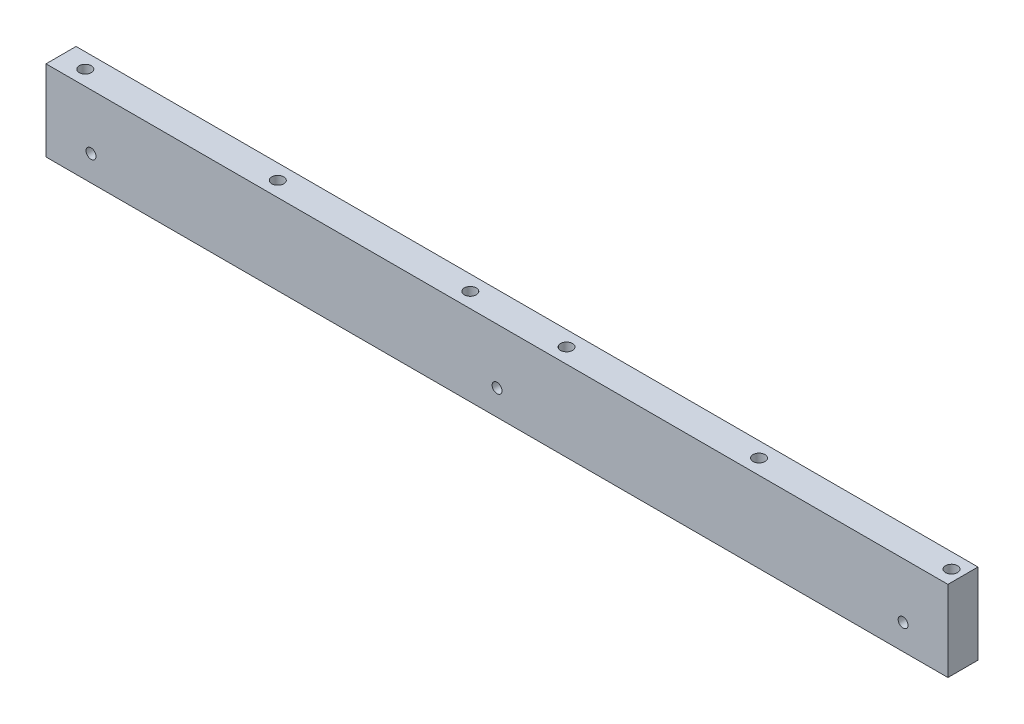
ISO-10303-21;
HEADER;
FILE_DESCRIPTION(('STEP AP214'),'2;1');
FILE_NAME('part.step','',(''),(''),'','','');
FILE_SCHEMA(('AUTOMOTIVE_DESIGN { 1 0 10303 214 1 1 1 1 }'));
ENDSEC;
DATA;
#1=APPLICATION_CONTEXT('core data for automotive mechanical design processes');
#2=APPLICATION_PROTOCOL_DEFINITION('international standard','automotive_design',2000,#1);
#3=PRODUCT_CONTEXT('',#1,'mechanical');
#4=PRODUCT('Part','Part','',(#3));
#5=PRODUCT_RELATED_PRODUCT_CATEGORY('part','',(#4));
#6=PRODUCT_DEFINITION_FORMATION('','',#4);
#7=PRODUCT_DEFINITION_CONTEXT('part definition',#1,'design');
#8=PRODUCT_DEFINITION('design','',#6,#7);
#9=PRODUCT_DEFINITION_SHAPE('','',#8);
#10=(LENGTH_UNIT() NAMED_UNIT(*) SI_UNIT(.MILLI.,.METRE.));
#11=(NAMED_UNIT(*) PLANE_ANGLE_UNIT() SI_UNIT($,.RADIAN.));
#12=(NAMED_UNIT(*) SI_UNIT($,.STERADIAN.) SOLID_ANGLE_UNIT());
#13=UNCERTAINTY_MEASURE_WITH_UNIT(LENGTH_MEASURE(1.E-05),#10,'distance_accuracy_value','');
#14=(GEOMETRIC_REPRESENTATION_CONTEXT(3) GLOBAL_UNCERTAINTY_ASSIGNED_CONTEXT((#13)) GLOBAL_UNIT_ASSIGNED_CONTEXT((#10,
#11,#12)) REPRESENTATION_CONTEXT('',''));
#15=CARTESIAN_POINT('',(0.,0.,0.));
#16=DIRECTION('',(0.,0.,1.));
#17=DIRECTION('',(1.,0.,0.));
#18=AXIS2_PLACEMENT_3D('',#15,#16,#17);
#19=CARTESIAN_POINT('',(-14.9575342492625,-8.48784027490979,26.));
#20=DIRECTION('',(-0.000163272586842843,0.999999986671031,0.));
#21=DIRECTION('',(-0.999999986671031,-0.000163272586842843,0.));
#22=AXIS2_PLACEMENT_3D('',#19,#20,#21);
#23=PLANE('',#22);
#24=CARTESIAN_POINT('',(-6.87153128233984,-8.48652005227056,21.0249021594212));
#25=DIRECTION('',(-0.000163272586842843,0.999999986671031,0.));
#26=DIRECTION('',(-0.999999986671031,-0.000163272586842843,0.));
#27=AXIS2_PLACEMENT_3D('',#24,#25,#26);
#28=CIRCLE('',#27,2.00326040741542);
#29=CARTESIAN_POINT('',(-8.87479166305386,-8.4868471297794,21.0249021594212));
#30=VERTEX_POINT('',#29);
#31=EDGE_CURVE('E136',#30,#30,#28,.T.);
#32=ORIENTED_EDGE('',*,*,#31,.T.);
#33=EDGE_LOOP('',(#32));
#34=FACE_BOUND('',#33,.T.);
#35=CARTESIAN_POINT('',(57.1284678646062,-8.47607060671262,21.0249021594212));
#36=DIRECTION('',(-0.000163272586842843,0.999999986671031,0.));
#37=DIRECTION('',(-0.999999986671031,-0.000163272586842843,0.));
#38=AXIS2_PLACEMENT_3D('',#35,#36,#37);
#39=CIRCLE('',#38,2.00326040741543);
#40=CARTESIAN_POINT('',(55.1252074838921,-8.47639768422146,21.0249021594212));
#41=VERTEX_POINT('',#40);
#42=EDGE_CURVE('E140',#41,#41,#39,.T.);
#43=ORIENTED_EDGE('',*,*,#42,.T.);
#44=EDGE_LOOP('',(#43));
#45=FACE_BOUND('',#44,.T.);
#46=CARTESIAN_POINT('',(121.128467011552,-8.46562116115468,21.0249021594212));
#47=DIRECTION('',(-0.000163272586842843,0.999999986671031,0.));
#48=DIRECTION('',(-0.999999986671031,-0.000163272586842843,0.));
#49=AXIS2_PLACEMENT_3D('',#46,#47,#48);
#50=CIRCLE('',#49,2.00326040741542);
#51=CARTESIAN_POINT('',(119.125206630838,-8.46594823866351,21.0249021594212));
#52=VERTEX_POINT('',#51);
#53=EDGE_CURVE('E144',#52,#52,#50,.T.);
#54=ORIENTED_EDGE('',*,*,#53,.T.);
#55=EDGE_LOOP('',(#54));
#56=FACE_BOUND('',#55,.T.);
#57=CARTESIAN_POINT('',(153.128466585025,-8.46039643837571,21.0249021594212));
#58=DIRECTION('',(-0.000163272586842843,0.999999986671031,0.));
#59=DIRECTION('',(-0.999999986671031,-0.000163272586842843,0.));
#60=AXIS2_PLACEMENT_3D('',#57,#58,#59);
#61=CIRCLE('',#60,2.00326040741541);
#62=CARTESIAN_POINT('',(151.125206204311,-8.46072351588455,21.0249021594212));
#63=VERTEX_POINT('',#62);
#64=EDGE_CURVE('E148',#63,#63,#61,.T.);
#65=ORIENTED_EDGE('',*,*,#64,.T.);
#66=EDGE_LOOP('',(#65));
#67=FACE_BOUND('',#66,.T.);
#68=CARTESIAN_POINT('',(217.128465731971,-8.44994699281776,21.0249021594212));
#69=DIRECTION('',(-0.000163272586842843,0.999999986671031,0.));
#70=DIRECTION('',(-0.999999986671031,-0.000163272586842843,0.));
#71=AXIS2_PLACEMENT_3D('',#68,#69,#70);
#72=CIRCLE('',#71,2.00326040741541);
#73=CARTESIAN_POINT('',(215.125205351257,-8.4502740703266,21.0249021594212));
#74=VERTEX_POINT('',#73);
#75=EDGE_CURVE('E152',#74,#74,#72,.T.);
#76=ORIENTED_EDGE('',*,*,#75,.T.);
#77=EDGE_LOOP('',(#76));
#78=FACE_BOUND('',#77,.T.);
#79=CARTESIAN_POINT('',(281.128464878917,-8.43949754725982,21.0249021594212));
#80=DIRECTION('',(-0.000163272586842843,0.999999986671031,0.));
#81=DIRECTION('',(-0.999999986671031,-0.000163272586842843,0.));
#82=AXIS2_PLACEMENT_3D('',#79,#80,#81);
#83=CIRCLE('',#82,2.00326040741546);
#84=CARTESIAN_POINT('',(279.125204498203,-8.43982462476866,21.0249021594212));
#85=VERTEX_POINT('',#84);
#86=EDGE_CURVE('E155',#85,#85,#83,.T.);
#87=ORIENTED_EDGE('',*,*,#86,.T.);
#88=EDGE_LOOP('',(#87));
#89=FACE_BOUND('',#88,.T.);
#90=DIRECTION('',(0.999999986671031,0.000163272586842843,0.));
#91=VECTOR('',#90,1.);
#92=CARTESIAN_POINT('',(-14.9575342492625,-8.48784027490979,16.));
#93=LINE('',#92,#91);
#94=CARTESIAN_POINT('',(-14.9575342492625,-8.48784027490979,16.));
#95=VERTEX_POINT('',#94);
#96=CARTESIAN_POINT('',(284.912453052527,-8.4388797257139,16.));
#97=VERTEX_POINT('',#96);
#98=EDGE_CURVE('E98',#95,#97,#93,.T.);
#99=ORIENTED_EDGE('',*,*,#98,.T.);
#100=DIRECTION('',(0.,0.,-1.));
#101=VECTOR('',#100,1.);
#102=CARTESIAN_POINT('',(284.912453052527,-8.4388797257139,26.));
#103=LINE('',#102,#101);
#104=CARTESIAN_POINT('',(284.912453052527,-8.4388797257139,26.));
#105=VERTEX_POINT('',#104);
#106=EDGE_CURVE('E11',#105,#97,#103,.T.);
#107=ORIENTED_EDGE('',*,*,#106,.F.);
#108=DIRECTION('',(0.999999986671031,0.000163272586842843,0.));
#109=VECTOR('',#108,1.);
#110=CARTESIAN_POINT('',(-14.9575342492625,-8.48784027490979,26.));
#111=LINE('',#110,#109);
#112=CARTESIAN_POINT('',(-14.9575342492625,-8.48784027490979,26.));
#113=VERTEX_POINT('',#112);
#114=EDGE_CURVE('E75',#113,#105,#111,.T.);
#115=ORIENTED_EDGE('',*,*,#114,.F.);
#116=DIRECTION('',(0.,0.,-1.));
#117=VECTOR('',#116,1.);
#118=CARTESIAN_POINT('',(-14.9575342492625,-8.48784027490979,26.));
#119=LINE('',#118,#117);
#120=EDGE_CURVE('E94',#113,#95,#119,.T.);
#121=ORIENTED_EDGE('',*,*,#120,.T.);
#122=EDGE_LOOP('',(#99,#107,#115,#121));
#123=FACE_BOUND('',#122,.T.);
#124=ADVANCED_FACE('F36',(#34,#45,#56,#67,#78,#89,#123),#23,.F.);
#125=CARTESIAN_POINT('',(284.908071309528,18.3980990053308,26.));
#126=DIRECTION('',(0.999999986671031,0.000163272586843374,0.));
#127=DIRECTION('',(-0.000163272586843374,0.999999986671031,0.));
#128=AXIS2_PLACEMENT_3D('',#125,#126,#127);
#129=PLANE('',#128);
#130=DIRECTION('',(0.000163272586843374,-0.999999986671031,0.));
#131=VECTOR('',#130,1.);
#132=CARTESIAN_POINT('',(284.908071309528,18.3980990053308,16.));
#133=LINE('',#132,#131);
#134=CARTESIAN_POINT('',(284.908071309528,18.3980990053308,16.));
#135=VERTEX_POINT('',#134);
#136=EDGE_CURVE('E84',#135,#97,#133,.T.);
#137=ORIENTED_EDGE('',*,*,#136,.F.);
#138=DIRECTION('',(0.,0.,-1.));
#139=VECTOR('',#138,1.);
#140=CARTESIAN_POINT('',(284.908071309528,18.3980990053308,26.));
#141=LINE('',#140,#139);
#142=CARTESIAN_POINT('',(284.908071309528,18.3980990053308,26.));
#143=VERTEX_POINT('',#142);
#144=EDGE_CURVE('E44',#143,#135,#141,.T.);
#145=ORIENTED_EDGE('',*,*,#144,.F.);
#146=DIRECTION('',(0.000163272586843374,-0.999999986671031,0.));
#147=VECTOR('',#146,1.);
#148=CARTESIAN_POINT('',(284.908071309528,18.3980990053308,26.));
#149=LINE('',#148,#147);
#150=EDGE_CURVE('E82',#143,#105,#149,.T.);
#151=ORIENTED_EDGE('',*,*,#150,.T.);
#152=ORIENTED_EDGE('',*,*,#106,.T.);
#153=EDGE_LOOP('',(#137,#145,#151,#152));
#154=FACE_BOUND('',#153,.T.);
#155=ADVANCED_FACE('F81',(#154),#129,.T.);
#156=CARTESIAN_POINT('',(-14.9619159922614,18.3491384561349,26.));
#157=DIRECTION('',(-0.000163272586842843,0.999999986671031,0.));
#158=DIRECTION('',(-0.999999986671031,-0.000163272586842843,0.));
#159=AXIS2_PLACEMENT_3D('',#156,#157,#158);
#160=PLANE('',#159);
#161=CARTESIAN_POINT('',(-6.8759130253387,18.3504586787741,21.0249021594212));
#162=DIRECTION('',(-0.000163272586842843,0.999999986671031,0.));
#163=DIRECTION('',(-0.999999986671031,-0.000163272586842843,0.));
#164=AXIS2_PLACEMENT_3D('',#161,#162,#163);
#165=CIRCLE('',#164,2.00326040741542);
#166=CARTESIAN_POINT('',(-8.87917340605273,18.3501316012653,21.0249021594212));
#167=VERTEX_POINT('',#166);
#168=EDGE_CURVE('E157',#167,#167,#165,.T.);
#169=ORIENTED_EDGE('',*,*,#168,.F.);
#170=EDGE_LOOP('',(#169));
#171=FACE_BOUND('',#170,.T.);
#172=CARTESIAN_POINT('',(57.1240861216073,18.3609081243321,21.0249021594212));
#173=DIRECTION('',(-0.000163272586842843,0.999999986671031,0.));
#174=DIRECTION('',(-0.999999986671031,-0.000163272586842843,0.));
#175=AXIS2_PLACEMENT_3D('',#172,#173,#174);
#176=CIRCLE('',#175,2.00326040741543);
#177=CARTESIAN_POINT('',(55.1208257408933,18.3605810468232,21.0249021594212));
#178=VERTEX_POINT('',#177);
#179=EDGE_CURVE('E161',#178,#178,#176,.T.);
#180=ORIENTED_EDGE('',*,*,#179,.F.);
#181=EDGE_LOOP('',(#180));
#182=FACE_BOUND('',#181,.T.);
#183=CARTESIAN_POINT('',(121.124085268553,18.37135756989,21.0249021594212));
#184=DIRECTION('',(-0.000163272586842843,0.999999986671031,0.));
#185=DIRECTION('',(-0.999999986671031,-0.000163272586842843,0.));
#186=AXIS2_PLACEMENT_3D('',#183,#184,#185);
#187=CIRCLE('',#186,2.00326040741542);
#188=CARTESIAN_POINT('',(119.120824887839,18.3710304923812,21.0249021594212));
#189=VERTEX_POINT('',#188);
#190=EDGE_CURVE('E242',#189,#189,#187,.T.);
#191=ORIENTED_EDGE('',*,*,#190,.F.);
#192=EDGE_LOOP('',(#191));
#193=FACE_BOUND('',#192,.T.);
#194=CARTESIAN_POINT('',(153.124084842026,18.376582292669,21.0249021594212));
#195=DIRECTION('',(-0.000163272586842843,0.999999986671031,0.));
#196=DIRECTION('',(-0.999999986671031,-0.000163272586842843,0.));
#197=AXIS2_PLACEMENT_3D('',#194,#195,#196);
#198=CIRCLE('',#197,2.00326040741541);
#199=CARTESIAN_POINT('',(151.120824461312,18.3762552151601,21.0249021594212));
#200=VERTEX_POINT('',#199);
#201=EDGE_CURVE('E246',#200,#200,#198,.T.);
#202=ORIENTED_EDGE('',*,*,#201,.F.);
#203=EDGE_LOOP('',(#202));
#204=FACE_BOUND('',#203,.T.);
#205=CARTESIAN_POINT('',(217.124083988972,18.3870317382269,21.0249021594212));
#206=DIRECTION('',(-0.000163272586842843,0.999999986671031,0.));
#207=DIRECTION('',(-0.999999986671031,-0.000163272586842843,0.));
#208=AXIS2_PLACEMENT_3D('',#205,#206,#207);
#209=CIRCLE('',#208,2.00326040741541);
#210=CARTESIAN_POINT('',(215.120823608258,18.3867046607181,21.0249021594212));
#211=VERTEX_POINT('',#210);
#212=EDGE_CURVE('E250',#211,#211,#209,.T.);
#213=ORIENTED_EDGE('',*,*,#212,.F.);
#214=EDGE_LOOP('',(#213));
#215=FACE_BOUND('',#214,.T.);
#216=CARTESIAN_POINT('',(281.124083135918,18.3974811837849,21.0249021594212));
#217=DIRECTION('',(-0.000163272586842843,0.999999986671031,0.));
#218=DIRECTION('',(-0.999999986671031,-0.000163272586842843,0.));
#219=AXIS2_PLACEMENT_3D('',#216,#217,#218);
#220=CIRCLE('',#219,2.00326040741546);
#221=CARTESIAN_POINT('',(279.120822755204,18.397154106276,21.0249021594212));
#222=VERTEX_POINT('',#221);
#223=EDGE_CURVE('E164',#222,#222,#220,.T.);
#224=ORIENTED_EDGE('',*,*,#223,.F.);
#225=EDGE_LOOP('',(#224));
#226=FACE_BOUND('',#225,.T.);
#227=DIRECTION('',(0.999999986671031,0.000163272586842843,0.));
#228=VECTOR('',#227,1.);
#229=CARTESIAN_POINT('',(-14.9619159922614,18.3491384561349,16.));
#230=LINE('',#229,#228);
#231=CARTESIAN_POINT('',(-14.9619159922614,18.3491384561349,16.));
#232=VERTEX_POINT('',#231);
#233=EDGE_CURVE('E103',#232,#135,#230,.T.);
#234=ORIENTED_EDGE('',*,*,#233,.F.);
#235=DIRECTION('',(0.,0.,-1.));
#236=VECTOR('',#235,1.);
#237=CARTESIAN_POINT('',(-14.9619159922614,18.3491384561349,26.));
#238=LINE('',#237,#236);
#239=CARTESIAN_POINT('',(-14.9619159922614,18.3491384561349,26.));
#240=VERTEX_POINT('',#239);
#241=EDGE_CURVE('E67',#240,#232,#238,.T.);
#242=ORIENTED_EDGE('',*,*,#241,.F.);
#243=DIRECTION('',(0.999999986671031,0.000163272586842843,0.));
#244=VECTOR('',#243,1.);
#245=CARTESIAN_POINT('',(-14.9619159922614,18.3491384561349,26.));
#246=LINE('',#245,#244);
#247=EDGE_CURVE('E90',#240,#143,#246,.T.);
#248=ORIENTED_EDGE('',*,*,#247,.T.);
#249=ORIENTED_EDGE('',*,*,#144,.T.);
#250=EDGE_LOOP('',(#234,#242,#248,#249));
#251=FACE_BOUND('',#250,.T.);
#252=ADVANCED_FACE('F92',(#171,#182,#193,#204,#215,#226,#251),#160,.T.);
#253=CARTESIAN_POINT('',(-14.9619159922614,18.3491384561349,26.));
#254=DIRECTION('',(0.999999986671031,0.000163272586842857,0.));
#255=DIRECTION('',(-0.000163272586842857,0.999999986671031,0.));
#256=AXIS2_PLACEMENT_3D('',#253,#254,#255);
#257=PLANE('',#256);
#258=DIRECTION('',(0.000163272586842857,-0.999999986671031,0.));
#259=VECTOR('',#258,1.);
#260=CARTESIAN_POINT('',(-14.9619159922614,18.3491384561349,16.));
#261=LINE('',#260,#259);
#262=EDGE_CURVE('E70',#232,#95,#261,.T.);
#263=ORIENTED_EDGE('',*,*,#262,.T.);
#264=ORIENTED_EDGE('',*,*,#120,.F.);
#265=DIRECTION('',(0.000163272586842857,-0.999999986671031,0.));
#266=VECTOR('',#265,1.);
#267=CARTESIAN_POINT('',(-14.9619159922614,18.3491384561349,26.));
#268=LINE('',#267,#266);
#269=EDGE_CURVE('E52',#240,#113,#268,.T.);
#270=ORIENTED_EDGE('',*,*,#269,.F.);
#271=ORIENTED_EDGE('',*,*,#241,.T.);
#272=EDGE_LOOP('',(#263,#264,#270,#271));
#273=FACE_BOUND('',#272,.T.);
#274=ADVANCED_FACE('F122',(#273),#257,.F.);
#275=CARTESIAN_POINT('',(0.,0.,26.));
#276=DIRECTION('',(0.,0.,-1.));
#277=DIRECTION('',(-1.,0.,0.));
#278=AXIS2_PLACEMENT_3D('',#275,#276,#277);
#279=PLANE('',#278);
#280=CARTESIAN_POINT('',(0.00514657222243988,-0.0110711279105043,26.));
#281=DIRECTION('',(0.,0.,-1.));
#282=DIRECTION('',(-1.,0.,0.));
#283=AXIS2_PLACEMENT_3D('',#280,#281,#282);
#284=CIRCLE('',#283,1.65073701686937);
#285=CARTESIAN_POINT('',(-1.64559044464693,-0.0110711279105043,26.));
#286=VERTEX_POINT('',#285);
#287=EDGE_CURVE('E174',#286,#286,#284,.T.);
#288=ORIENTED_EDGE('',*,*,#287,.T.);
#289=EDGE_LOOP('',(#288));
#290=FACE_BOUND('',#289,.T.);
#291=CARTESIAN_POINT('',(269.998815675551,-0.00740826404222681,26.));
#292=DIRECTION('',(0.,0.,-1.));
#293=DIRECTION('',(-1.,0.,0.));
#294=AXIS2_PLACEMENT_3D('',#291,#292,#293);
#295=CIRCLE('',#294,1.63801674296482);
#296=CARTESIAN_POINT('',(268.360798932586,-0.00740826404222681,26.));
#297=VERTEX_POINT('',#296);
#298=EDGE_CURVE('E180',#297,#297,#295,.T.);
#299=ORIENTED_EDGE('',*,*,#298,.T.);
#300=EDGE_LOOP('',(#299));
#301=FACE_BOUND('',#300,.T.);
#302=CARTESIAN_POINT('',(135.002587550413,-0.00593877986236514,26.));
#303=DIRECTION('',(0.,0.,-1.));
#304=DIRECTION('',(-1.,0.,0.));
#305=AXIS2_PLACEMENT_3D('',#302,#303,#304);
#306=CIRCLE('',#305,1.63676002784659);
#307=CARTESIAN_POINT('',(133.365827522567,-0.00593877986236514,26.));
#308=VERTEX_POINT('',#307);
#309=EDGE_CURVE('E101',#308,#308,#306,.T.);
#310=ORIENTED_EDGE('',*,*,#309,.T.);
#311=EDGE_LOOP('',(#310));
#312=FACE_BOUND('',#311,.T.);
#313=ORIENTED_EDGE('',*,*,#114,.T.);
#314=ORIENTED_EDGE('',*,*,#150,.F.);
#315=ORIENTED_EDGE('',*,*,#247,.F.);
#316=ORIENTED_EDGE('',*,*,#269,.T.);
#317=EDGE_LOOP('',(#313,#314,#315,#316));
#318=FACE_BOUND('',#317,.T.);
#319=ADVANCED_FACE('F89',(#290,#301,#312,#318),#279,.F.);
#320=CARTESIAN_POINT('',(0.,0.,16.));
#321=DIRECTION('',(0.,0.,-1.));
#322=DIRECTION('',(-1.,0.,0.));
#323=AXIS2_PLACEMENT_3D('',#320,#321,#322);
#324=PLANE('',#323);
#325=CARTESIAN_POINT('',(0.00514657222243988,-0.0110711279105043,16.));
#326=DIRECTION('',(0.,0.,-1.));
#327=DIRECTION('',(-1.,0.,0.));
#328=AXIS2_PLACEMENT_3D('',#325,#326,#327);
#329=CIRCLE('',#328,1.65073701686937);
#330=CARTESIAN_POINT('',(-1.64559044464693,-0.0110711279105043,16.));
#331=VERTEX_POINT('',#330);
#332=EDGE_CURVE('E171',#331,#331,#329,.T.);
#333=ORIENTED_EDGE('',*,*,#332,.F.);
#334=EDGE_LOOP('',(#333));
#335=FACE_BOUND('',#334,.T.);
#336=CARTESIAN_POINT('',(269.998815675551,-0.00740826404222681,16.));
#337=DIRECTION('',(0.,0.,-1.));
#338=DIRECTION('',(-1.,0.,0.));
#339=AXIS2_PLACEMENT_3D('',#336,#337,#338);
#340=CIRCLE('',#339,1.63801674296482);
#341=CARTESIAN_POINT('',(268.360798932586,-0.00740826404222681,16.));
#342=VERTEX_POINT('',#341);
#343=EDGE_CURVE('E177',#342,#342,#340,.T.);
#344=ORIENTED_EDGE('',*,*,#343,.F.);
#345=EDGE_LOOP('',(#344));
#346=FACE_BOUND('',#345,.T.);
#347=CARTESIAN_POINT('',(135.002587550413,-0.00593877986236514,16.));
#348=DIRECTION('',(0.,0.,-1.));
#349=DIRECTION('',(-1.,0.,0.));
#350=AXIS2_PLACEMENT_3D('',#347,#348,#349);
#351=CIRCLE('',#350,1.63676002784659);
#352=CARTESIAN_POINT('',(133.365827522567,-0.00593877986236514,16.));
#353=VERTEX_POINT('',#352);
#354=EDGE_CURVE('E183',#353,#353,#351,.T.);
#355=ORIENTED_EDGE('',*,*,#354,.F.);
#356=EDGE_LOOP('',(#355));
#357=FACE_BOUND('',#356,.T.);
#358=ORIENTED_EDGE('',*,*,#98,.F.);
#359=ORIENTED_EDGE('',*,*,#262,.F.);
#360=ORIENTED_EDGE('',*,*,#233,.T.);
#361=ORIENTED_EDGE('',*,*,#136,.T.);
#362=EDGE_LOOP('',(#358,#359,#360,#361));
#363=FACE_BOUND('',#362,.T.);
#364=ADVANCED_FACE('F110',(#335,#346,#357,#363),#324,.T.);
#365=CARTESIAN_POINT('',(135.002587550413,-0.00593877986236514,43.));
#366=DIRECTION('',(0.,0.,-1.));
#367=DIRECTION('',(-1.,0.,0.));
#368=AXIS2_PLACEMENT_3D('',#365,#366,#367);
#369=CYLINDRICAL_SURFACE('',#368,1.63676002784659);
#370=ORIENTED_EDGE('',*,*,#354,.T.);
#371=EDGE_LOOP('',(#370));
#372=FACE_BOUND('',#371,.T.);
#373=ORIENTED_EDGE('',*,*,#309,.F.);
#374=EDGE_LOOP('',(#373));
#375=FACE_BOUND('',#374,.T.);
#376=ADVANCED_FACE('F112',(#372,#375),#369,.F.);
#377=CARTESIAN_POINT('',(269.998815675551,-0.00740826404222681,43.));
#378=DIRECTION('',(0.,0.,-1.));
#379=DIRECTION('',(-1.,0.,0.));
#380=AXIS2_PLACEMENT_3D('',#377,#378,#379);
#381=CYLINDRICAL_SURFACE('',#380,1.63801674296482);
#382=ORIENTED_EDGE('',*,*,#343,.T.);
#383=EDGE_LOOP('',(#382));
#384=FACE_BOUND('',#383,.T.);
#385=ORIENTED_EDGE('',*,*,#298,.F.);
#386=EDGE_LOOP('',(#385));
#387=FACE_BOUND('',#386,.T.);
#388=ADVANCED_FACE('F119',(#384,#387),#381,.F.);
#389=CARTESIAN_POINT('',(0.00514657222243988,-0.0110711279105043,43.));
#390=DIRECTION('',(0.,0.,-1.));
#391=DIRECTION('',(-1.,0.,0.));
#392=AXIS2_PLACEMENT_3D('',#389,#390,#391);
#393=CYLINDRICAL_SURFACE('',#392,1.65073701686937);
#394=ORIENTED_EDGE('',*,*,#332,.T.);
#395=EDGE_LOOP('',(#394));
#396=FACE_BOUND('',#395,.T.);
#397=ORIENTED_EDGE('',*,*,#287,.F.);
#398=EDGE_LOOP('',(#397));
#399=FACE_BOUND('',#398,.T.);
#400=ADVANCED_FACE('F196',(#396,#399),#393,.F.);
#401=CARTESIAN_POINT('',(281.128491495763,-8.60251845633297,21.0249021594212));
#402=DIRECTION('',(-0.000163272586842843,0.999999986671031,0.));
#403=DIRECTION('',(-0.999999986671031,-0.000163272586842843,0.));
#404=AXIS2_PLACEMENT_3D('',#401,#402,#403);
#405=CYLINDRICAL_SURFACE('',#404,2.00326040741546);
#406=ORIENTED_EDGE('',*,*,#223,.T.);
#407=EDGE_LOOP('',(#406));
#408=FACE_BOUND('',#407,.T.);
#409=ORIENTED_EDGE('',*,*,#86,.F.);
#410=EDGE_LOOP('',(#409));
#411=FACE_BOUND('',#410,.T.);
#412=ADVANCED_FACE('F202',(#408,#411),#405,.F.);
#413=CARTESIAN_POINT('',(217.128492348817,-8.61296790189091,21.0249021594212));
#414=DIRECTION('',(-0.000163272586842843,0.999999986671031,0.));
#415=DIRECTION('',(-0.999999986671031,-0.000163272586842843,0.));
#416=AXIS2_PLACEMENT_3D('',#413,#414,#415);
#417=CYLINDRICAL_SURFACE('',#416,2.00326040741541);
#418=ORIENTED_EDGE('',*,*,#212,.T.);
#419=EDGE_LOOP('',(#418));
#420=FACE_BOUND('',#419,.T.);
#421=ORIENTED_EDGE('',*,*,#75,.F.);
#422=EDGE_LOOP('',(#421));
#423=FACE_BOUND('',#422,.T.);
#424=ADVANCED_FACE('F208',(#420,#423),#417,.F.);
#425=CARTESIAN_POINT('',(153.128493201871,-8.62341734744886,21.0249021594212));
#426=DIRECTION('',(-0.000163272586842843,0.999999986671031,0.));
#427=DIRECTION('',(-0.999999986671031,-0.000163272586842843,0.));
#428=AXIS2_PLACEMENT_3D('',#425,#426,#427);
#429=CYLINDRICAL_SURFACE('',#428,2.00326040741541);
#430=ORIENTED_EDGE('',*,*,#201,.T.);
#431=EDGE_LOOP('',(#430));
#432=FACE_BOUND('',#431,.T.);
#433=ORIENTED_EDGE('',*,*,#64,.F.);
#434=EDGE_LOOP('',(#433));
#435=FACE_BOUND('',#434,.T.);
#436=ADVANCED_FACE('F212',(#432,#435),#429,.F.);
#437=CARTESIAN_POINT('',(121.128493628398,-8.62864207022783,21.0249021594212));
#438=DIRECTION('',(-0.000163272586842843,0.999999986671031,0.));
#439=DIRECTION('',(-0.999999986671031,-0.000163272586842843,0.));
#440=AXIS2_PLACEMENT_3D('',#437,#438,#439);
#441=CYLINDRICAL_SURFACE('',#440,2.00326040741542);
#442=ORIENTED_EDGE('',*,*,#190,.T.);
#443=EDGE_LOOP('',(#442));
#444=FACE_BOUND('',#443,.T.);
#445=ORIENTED_EDGE('',*,*,#53,.F.);
#446=EDGE_LOOP('',(#445));
#447=FACE_BOUND('',#446,.T.);
#448=ADVANCED_FACE('F216',(#444,#447),#441,.F.);
#449=CARTESIAN_POINT('',(57.128494481452,-8.63909151578577,21.0249021594212));
#450=DIRECTION('',(-0.000163272586842843,0.999999986671031,0.));
#451=DIRECTION('',(-0.999999986671031,-0.000163272586842843,0.));
#452=AXIS2_PLACEMENT_3D('',#449,#450,#451);
#453=CYLINDRICAL_SURFACE('',#452,2.00326040741543);
#454=ORIENTED_EDGE('',*,*,#179,.T.);
#455=EDGE_LOOP('',(#454));
#456=FACE_BOUND('',#455,.T.);
#457=ORIENTED_EDGE('',*,*,#42,.F.);
#458=EDGE_LOOP('',(#457));
#459=FACE_BOUND('',#458,.T.);
#460=ADVANCED_FACE('F220',(#456,#459),#453,.F.);
#461=CARTESIAN_POINT('',(-6.87150466549395,-8.64954096134371,21.0249021594212));
#462=DIRECTION('',(-0.000163272586842843,0.999999986671031,0.));
#463=DIRECTION('',(-0.999999986671031,-0.000163272586842843,0.));
#464=AXIS2_PLACEMENT_3D('',#461,#462,#463);
#465=CYLINDRICAL_SURFACE('',#464,2.00326040741542);
#466=ORIENTED_EDGE('',*,*,#168,.T.);
#467=EDGE_LOOP('',(#466));
#468=FACE_BOUND('',#467,.T.);
#469=ORIENTED_EDGE('',*,*,#31,.F.);
#470=EDGE_LOOP('',(#469));
#471=FACE_BOUND('',#470,.T.);
#472=ADVANCED_FACE('F224',(#468,#471),#465,.F.);
#473=CLOSED_SHELL('',(#124,#155,#252,#274,#319,#364,#376,#388,#400,#412,#424,#436,#448,#460,#472));
#474=MANIFOLD_SOLID_BREP('B2',#473);
#475=ADVANCED_BREP_SHAPE_REPRESENTATION('',(#18,#474),#14);
#476=SHAPE_DEFINITION_REPRESENTATION(#9,#475);
ENDSEC;
END-ISO-10303-21;
